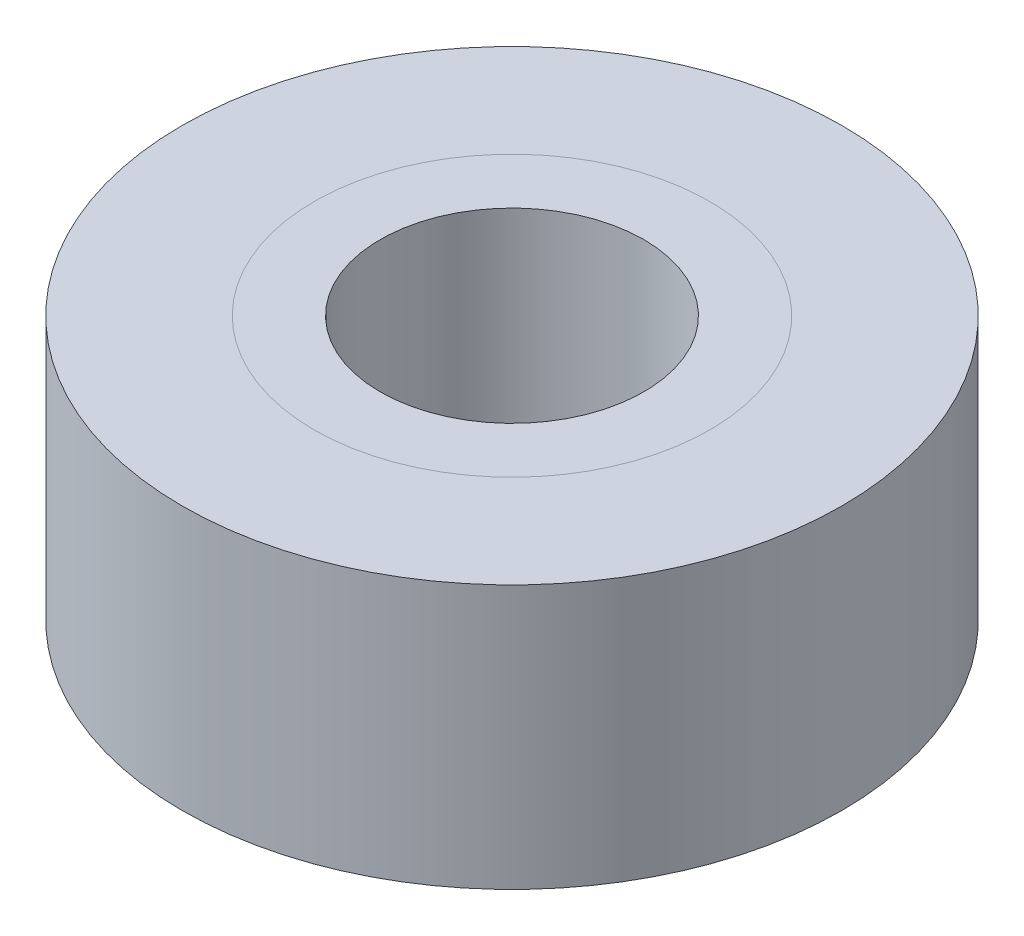
ISO-10303-21;
HEADER;
FILE_DESCRIPTION(('STEP AP214'),'2;1');
FILE_NAME('part.step','',(''),(''),'','','');
FILE_SCHEMA(('AUTOMOTIVE_DESIGN { 1 0 10303 214 1 1 1 1 }'));
ENDSEC;
DATA;
#1=APPLICATION_CONTEXT('core data for automotive mechanical design processes');
#2=APPLICATION_PROTOCOL_DEFINITION('international standard','automotive_design',2000,#1);
#3=PRODUCT_CONTEXT('',#1,'mechanical');
#4=PRODUCT('Part','Part','',(#3));
#5=PRODUCT_RELATED_PRODUCT_CATEGORY('part','',(#4));
#6=PRODUCT_DEFINITION_FORMATION('','',#4);
#7=PRODUCT_DEFINITION_CONTEXT('part definition',#1,'design');
#8=PRODUCT_DEFINITION('design','',#6,#7);
#9=PRODUCT_DEFINITION_SHAPE('','',#8);
#10=(LENGTH_UNIT() NAMED_UNIT(*) SI_UNIT(.MILLI.,.METRE.));
#11=(NAMED_UNIT(*) PLANE_ANGLE_UNIT() SI_UNIT($,.RADIAN.));
#12=(NAMED_UNIT(*) SI_UNIT($,.STERADIAN.) SOLID_ANGLE_UNIT());
#13=UNCERTAINTY_MEASURE_WITH_UNIT(LENGTH_MEASURE(1.E-05),#10,'distance_accuracy_value','');
#14=(GEOMETRIC_REPRESENTATION_CONTEXT(3) GLOBAL_UNCERTAINTY_ASSIGNED_CONTEXT((#13)) GLOBAL_UNIT_ASSIGNED_CONTEXT((#10,
#11,#12)) REPRESENTATION_CONTEXT('',''));
#15=CARTESIAN_POINT('',(0.,0.,0.));
#16=DIRECTION('',(0.,0.,1.));
#17=DIRECTION('',(1.,0.,0.));
#18=AXIS2_PLACEMENT_3D('',#15,#16,#17);
#19=CARTESIAN_POINT('',(-1.87190417358354,-19.5526336310094,-1.11652667925455));
#20=DIRECTION('',(0.,1.,0.));
#21=DIRECTION('',(0.,0.,1.));
#22=AXIS2_PLACEMENT_3D('',#19,#20,#21);
#23=CYLINDRICAL_SURFACE('',#22,3.);
#24=CARTESIAN_POINT('',(-1.87190417358354,-15.5526336310094,-1.11652667925455));
#25=DIRECTION('',(0.,1.,0.));
#26=DIRECTION('',(0.,0.,1.));
#27=AXIS2_PLACEMENT_3D('',#24,#25,#26);
#28=CIRCLE('',#27,3.);
#29=CARTESIAN_POINT('',(-1.87190417358354,-15.5526336310094,1.88347332074545));
#30=VERTEX_POINT('',#29);
#31=EDGE_CURVE('P0_E26',#30,#30,#28,.T.);
#32=ORIENTED_EDGE('',*,*,#31,.T.);
#33=EDGE_LOOP('',(#32));
#34=FACE_BOUND('',#33,.T.);
#35=CARTESIAN_POINT('',(-1.87190417358354,-19.5526336310094,-1.11652667925455));
#36=DIRECTION('',(0.,1.,0.));
#37=DIRECTION('',(0.,0.,1.));
#38=AXIS2_PLACEMENT_3D('',#35,#36,#37);
#39=CIRCLE('',#38,3.);
#40=CARTESIAN_POINT('',(-1.87190417358354,-19.5526336310094,1.88347332074545));
#41=VERTEX_POINT('',#40);
#42=EDGE_CURVE('P0_E17',#41,#41,#39,.T.);
#43=ORIENTED_EDGE('',*,*,#42,.F.);
#44=EDGE_LOOP('',(#43));
#45=FACE_BOUND('',#44,.T.);
#46=ADVANCED_FACE('P0_F14',(#34,#45),#23,.F.);
#47=CARTESIAN_POINT('',(-1.87190417358354,-19.5526336310094,-1.11652667925455));
#48=DIRECTION('',(0.,-1.,0.));
#49=DIRECTION('',(0.,0.,-1.));
#50=AXIS2_PLACEMENT_3D('',#47,#48,#49);
#51=PLANE('',#50);
#52=ORIENTED_EDGE('',*,*,#42,.T.);
#53=EDGE_LOOP('',(#52));
#54=FACE_BOUND('',#53,.T.);
#55=CARTESIAN_POINT('',(-1.87190417358354,-19.5526336310094,-1.11652667925455));
#56=DIRECTION('',(0.,1.,0.));
#57=DIRECTION('',(0.,0.,1.));
#58=AXIS2_PLACEMENT_3D('',#55,#56,#57);
#59=CIRCLE('',#58,5.00000000000002);
#60=CARTESIAN_POINT('',(-1.87190417358354,-19.5526336310094,3.88347332074547));
#61=VERTEX_POINT('',#60);
#62=EDGE_CURVE('P0_E21',#61,#61,#59,.T.);
#63=ORIENTED_EDGE('',*,*,#62,.F.);
#64=EDGE_LOOP('',(#63));
#65=FACE_BOUND('',#64,.T.);
#66=ADVANCED_FACE('P0_F34',(#54,#65),#51,.T.);
#67=CARTESIAN_POINT('',(-1.87190417358354,-15.5526336310094,-1.11652667925455));
#68=DIRECTION('',(0.,-1.,0.));
#69=DIRECTION('',(0.,0.,-1.));
#70=AXIS2_PLACEMENT_3D('',#67,#68,#69);
#71=PLANE('',#70);
#72=ORIENTED_EDGE('',*,*,#31,.F.);
#73=EDGE_LOOP('',(#72));
#74=FACE_BOUND('',#73,.T.);
#75=CARTESIAN_POINT('',(-1.87190417358354,-15.5526336310094,-1.11652667925455));
#76=DIRECTION('',(0.,1.,0.));
#77=DIRECTION('',(0.,0.,1.));
#78=AXIS2_PLACEMENT_3D('',#75,#76,#77);
#79=CIRCLE('',#78,5.00000000000002);
#80=CARTESIAN_POINT('',(-1.87190417358354,-15.5526336310094,3.88347332074547));
#81=VERTEX_POINT('',#80);
#82=EDGE_CURVE('P0_E10',#81,#81,#79,.F.);
#83=ORIENTED_EDGE('',*,*,#82,.F.);
#84=EDGE_LOOP('',(#83));
#85=FACE_BOUND('',#84,.T.);
#86=ADVANCED_FACE('P0_F42',(#74,#85),#71,.F.);
#87=CARTESIAN_POINT('',(-1.87190417358354,-19.5526336310094,-1.11652667925455));
#88=DIRECTION('',(0.,1.,0.));
#89=DIRECTION('',(0.,0.,1.));
#90=AXIS2_PLACEMENT_3D('',#87,#88,#89);
#91=CYLINDRICAL_SURFACE('',#90,5.00000000000002);
#92=ORIENTED_EDGE('',*,*,#82,.T.);
#93=EDGE_LOOP('',(#92));
#94=FACE_BOUND('',#93,.T.);
#95=ORIENTED_EDGE('',*,*,#62,.T.);
#96=EDGE_LOOP('',(#95));
#97=FACE_BOUND('',#96,.T.);
#98=ADVANCED_FACE('P0_F43',(#94,#97),#91,.T.);
#99=CLOSED_SHELL('',(#46,#66,#86,#98));
#100=MANIFOLD_SOLID_BREP('P0_B1',#99);
#101=CARTESIAN_POINT('',(-1.87190417358354,-19.5526336310094,-1.11652667925455));
#102=DIRECTION('',(0.,1.,0.));
#103=DIRECTION('',(0.,0.,1.));
#104=AXIS2_PLACEMENT_3D('',#101,#102,#103);
#105=CYLINDRICAL_SURFACE('',#104,2.);
#106=CARTESIAN_POINT('',(-1.87190417358354,-15.5526336310094,-1.11652667925455));
#107=DIRECTION('',(0.,1.,0.));
#108=DIRECTION('',(0.,0.,1.));
#109=AXIS2_PLACEMENT_3D('',#106,#107,#108);
#110=CIRCLE('',#109,2.);
#111=CARTESIAN_POINT('',(-1.87190417358354,-15.5526336310094,0.883473320745451));
#112=VERTEX_POINT('',#111);
#113=EDGE_CURVE('P1_E26',#112,#112,#110,.F.);
#114=ORIENTED_EDGE('',*,*,#113,.F.);
#115=EDGE_LOOP('',(#114));
#116=FACE_BOUND('',#115,.T.);
#117=CARTESIAN_POINT('',(-1.87190417358354,-19.5526336310094,-1.11652667925455));
#118=DIRECTION('',(0.,1.,0.));
#119=DIRECTION('',(0.,0.,1.));
#120=AXIS2_PLACEMENT_3D('',#117,#118,#119);
#121=CIRCLE('',#120,2.);
#122=CARTESIAN_POINT('',(-1.87190417358354,-19.5526336310094,0.883473320745451));
#123=VERTEX_POINT('',#122);
#124=EDGE_CURVE('P1_E17',#123,#123,#121,.F.);
#125=ORIENTED_EDGE('',*,*,#124,.T.);
#126=EDGE_LOOP('',(#125));
#127=FACE_BOUND('',#126,.T.);
#128=ADVANCED_FACE('P1_F14',(#116,#127),#105,.F.);
#129=CARTESIAN_POINT('',(-1.87190417358354,-19.5526336310094,-1.11652667925455));
#130=DIRECTION('',(0.,1.,0.));
#131=DIRECTION('',(0.,0.,1.));
#132=AXIS2_PLACEMENT_3D('',#129,#130,#131);
#133=PLANE('',#132);
#134=CARTESIAN_POINT('',(-1.87190417358354,-19.5526336310094,-1.11652667925455));
#135=DIRECTION('',(0.,1.,0.));
#136=DIRECTION('',(0.,0.,1.));
#137=AXIS2_PLACEMENT_3D('',#134,#135,#136);
#138=CIRCLE('',#137,3.);
#139=CARTESIAN_POINT('',(-1.87190417358354,-19.5526336310094,1.88347332074545));
#140=VERTEX_POINT('',#139);
#141=EDGE_CURVE('P1_E21',#140,#140,#138,.T.);
#142=ORIENTED_EDGE('',*,*,#141,.F.);
#143=EDGE_LOOP('',(#142));
#144=FACE_BOUND('',#143,.T.);
#145=ORIENTED_EDGE('',*,*,#124,.F.);
#146=EDGE_LOOP('',(#145));
#147=FACE_BOUND('',#146,.T.);
#148=ADVANCED_FACE('P1_F35',(#144,#147),#133,.F.);
#149=CARTESIAN_POINT('',(-1.87190417358354,-15.5526336310094,-1.11652667925455));
#150=DIRECTION('',(0.,1.,0.));
#151=DIRECTION('',(0.,0.,1.));
#152=AXIS2_PLACEMENT_3D('',#149,#150,#151);
#153=PLANE('',#152);
#154=CARTESIAN_POINT('',(-1.87190417358354,-15.5526336310094,-1.11652667925455));
#155=DIRECTION('',(0.,1.,0.));
#156=DIRECTION('',(0.,0.,1.));
#157=AXIS2_PLACEMENT_3D('',#154,#155,#156);
#158=CIRCLE('',#157,3.);
#159=CARTESIAN_POINT('',(-1.87190417358354,-15.5526336310094,1.88347332074545));
#160=VERTEX_POINT('',#159);
#161=EDGE_CURVE('P1_E10',#160,#160,#158,.F.);
#162=ORIENTED_EDGE('',*,*,#161,.F.);
#163=EDGE_LOOP('',(#162));
#164=FACE_BOUND('',#163,.T.);
#165=ORIENTED_EDGE('',*,*,#113,.T.);
#166=EDGE_LOOP('',(#165));
#167=FACE_BOUND('',#166,.T.);
#168=ADVANCED_FACE('P1_F37',(#164,#167),#153,.T.);
#169=CARTESIAN_POINT('',(-1.87190417358354,-19.5526336310094,-1.11652667925455));
#170=DIRECTION('',(0.,1.,0.));
#171=DIRECTION('',(0.,0.,1.));
#172=AXIS2_PLACEMENT_3D('',#169,#170,#171);
#173=CYLINDRICAL_SURFACE('',#172,3.);
#174=ORIENTED_EDGE('',*,*,#161,.T.);
#175=EDGE_LOOP('',(#174));
#176=FACE_BOUND('',#175,.T.);
#177=ORIENTED_EDGE('',*,*,#141,.T.);
#178=EDGE_LOOP('',(#177));
#179=FACE_BOUND('',#178,.T.);
#180=ADVANCED_FACE('P1_F44',(#176,#179),#173,.T.);
#181=CLOSED_SHELL('',(#128,#148,#168,#180));
#182=MANIFOLD_SOLID_BREP('P1_B1',#181);
#183=ADVANCED_BREP_SHAPE_REPRESENTATION('',(#18,#100,#182),#14);
#184=SHAPE_DEFINITION_REPRESENTATION(#9,#183);
ENDSEC;
END-ISO-10303-21;
